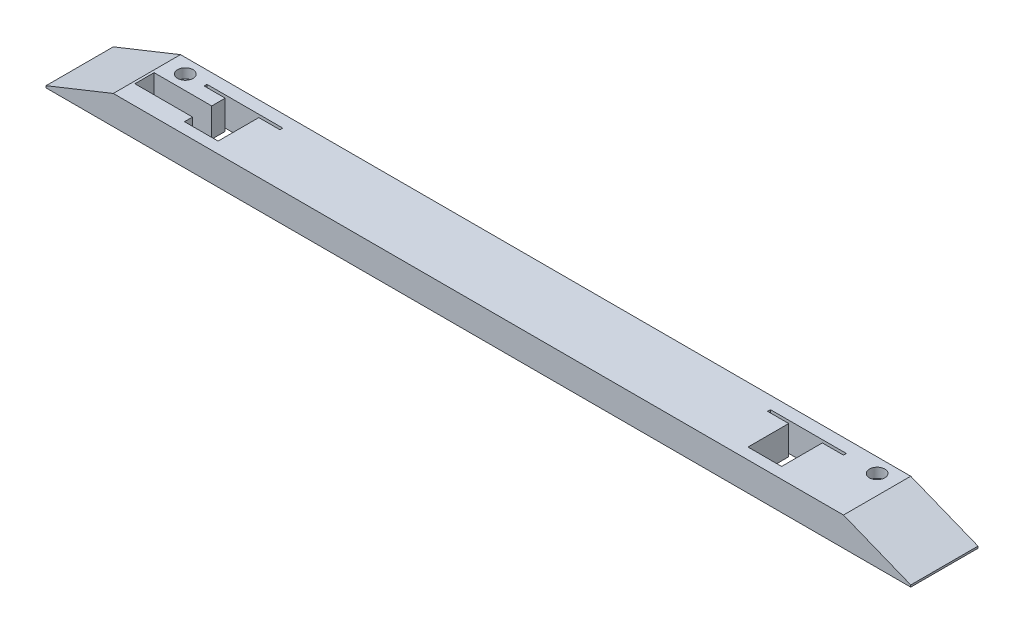
ISO-10303-21;
HEADER;
FILE_DESCRIPTION(('STEP AP214'),'2;1');
FILE_NAME('part.step','',(''),(''),'','','');
FILE_SCHEMA(('AUTOMOTIVE_DESIGN { 1 0 10303 214 1 1 1 1 }'));
ENDSEC;
DATA;
#1=APPLICATION_CONTEXT('core data for automotive mechanical design processes');
#2=APPLICATION_PROTOCOL_DEFINITION('international standard','automotive_design',2000,#1);
#3=PRODUCT_CONTEXT('',#1,'mechanical');
#4=PRODUCT('Part','Part','',(#3));
#5=PRODUCT_RELATED_PRODUCT_CATEGORY('part','',(#4));
#6=PRODUCT_DEFINITION_FORMATION('','',#4);
#7=PRODUCT_DEFINITION_CONTEXT('part definition',#1,'design');
#8=PRODUCT_DEFINITION('design','',#6,#7);
#9=PRODUCT_DEFINITION_SHAPE('','',#8);
#10=(LENGTH_UNIT() NAMED_UNIT(*) SI_UNIT(.MILLI.,.METRE.));
#11=(NAMED_UNIT(*) PLANE_ANGLE_UNIT() SI_UNIT($,.RADIAN.));
#12=(NAMED_UNIT(*) SI_UNIT($,.STERADIAN.) SOLID_ANGLE_UNIT());
#13=UNCERTAINTY_MEASURE_WITH_UNIT(LENGTH_MEASURE(1.E-05),#10,'distance_accuracy_value','');
#14=(GEOMETRIC_REPRESENTATION_CONTEXT(3) GLOBAL_UNCERTAINTY_ASSIGNED_CONTEXT((#13)) GLOBAL_UNIT_ASSIGNED_CONTEXT((#10,
#11,#12)) REPRESENTATION_CONTEXT('',''));
#15=CARTESIAN_POINT('',(0.,0.,0.));
#16=DIRECTION('',(0.,0.,1.));
#17=DIRECTION('',(1.,0.,0.));
#18=AXIS2_PLACEMENT_3D('',#15,#16,#17);
#19=CARTESIAN_POINT('',(0.,1.,0.));
#20=DIRECTION('',(-1.,0.,0.));
#21=DIRECTION('',(0.,0.,1.));
#22=AXIS2_PLACEMENT_3D('',#19,#20,#21);
#23=PLANE('',#22);
#24=DIRECTION('',(0.,-1.,0.));
#25=VECTOR('',#24,1.);
#26=CARTESIAN_POINT('',(0.,1.,35.));
#27=LINE('',#26,#25);
#28=CARTESIAN_POINT('',(0.,1.,35.));
#29=VERTEX_POINT('',#28);
#30=CARTESIAN_POINT('',(0.,0.,35.));
#31=VERTEX_POINT('',#30);
#32=EDGE_CURVE('E358',#29,#31,#27,.T.);
#33=ORIENTED_EDGE('',*,*,#32,.F.);
#34=DIRECTION('',(0.,0.,1.));
#35=VECTOR('',#34,1.);
#36=CARTESIAN_POINT('',(0.,1.,0.));
#37=LINE('',#36,#35);
#38=CARTESIAN_POINT('',(0.,1.,0.));
#39=VERTEX_POINT('',#38);
#40=EDGE_CURVE('E11',#39,#29,#37,.T.);
#41=ORIENTED_EDGE('',*,*,#40,.F.);
#42=DIRECTION('',(0.,-1.,0.));
#43=VECTOR('',#42,1.);
#44=CARTESIAN_POINT('',(0.,1.,0.));
#45=LINE('',#44,#43);
#46=CARTESIAN_POINT('',(0.,0.,0.));
#47=VERTEX_POINT('',#46);
#48=EDGE_CURVE('E373',#39,#47,#45,.T.);
#49=ORIENTED_EDGE('',*,*,#48,.T.);
#50=DIRECTION('',(0.,0.,1.));
#51=VECTOR('',#50,1.);
#52=CARTESIAN_POINT('',(0.,0.,0.));
#53=LINE('',#52,#51);
#54=EDGE_CURVE('E35',#47,#31,#53,.T.);
#55=ORIENTED_EDGE('',*,*,#54,.T.);
#56=EDGE_LOOP('',(#33,#41,#49,#55));
#57=FACE_BOUND('',#56,.T.);
#58=ADVANCED_FACE('F32',(#57),#23,.T.);
#59=CARTESIAN_POINT('',(35.,15.,0.));
#60=DIRECTION('',(-0.371390676354104,0.928476690885259,0.));
#61=DIRECTION('',(-0.92847669088526,-0.371390676354104,0.));
#62=AXIS2_PLACEMENT_3D('',#59,#60,#61);
#63=PLANE('',#62);
#64=DIRECTION('',(-0.928476690885259,-0.371390676354104,0.));
#65=VECTOR('',#64,1.);
#66=CARTESIAN_POINT('',(35.,15.,35.));
#67=LINE('',#66,#65);
#68=CARTESIAN_POINT('',(35.,15.,35.));
#69=VERTEX_POINT('',#68);
#70=EDGE_CURVE('E377',#69,#29,#67,.T.);
#71=ORIENTED_EDGE('',*,*,#70,.F.);
#72=DIRECTION('',(0.,0.,1.));
#73=VECTOR('',#72,1.);
#74=CARTESIAN_POINT('',(35.,15.,0.));
#75=LINE('',#74,#73);
#76=CARTESIAN_POINT('',(35.,15.,0.));
#77=VERTEX_POINT('',#76);
#78=EDGE_CURVE('E40',#77,#69,#75,.T.);
#79=ORIENTED_EDGE('',*,*,#78,.F.);
#80=DIRECTION('',(-0.928476690885259,-0.371390676354104,0.));
#81=VECTOR('',#80,1.);
#82=CARTESIAN_POINT('',(35.,15.,0.));
#83=LINE('',#82,#81);
#84=EDGE_CURVE('E389',#77,#39,#83,.T.);
#85=ORIENTED_EDGE('',*,*,#84,.T.);
#86=ORIENTED_EDGE('',*,*,#40,.T.);
#87=EDGE_LOOP('',(#71,#79,#85,#86));
#88=FACE_BOUND('',#87,.T.);
#89=ADVANCED_FACE('F426',(#88),#63,.T.);
#90=CARTESIAN_POINT('',(415.,15.,0.));
#91=DIRECTION('',(0.,1.,0.));
#92=DIRECTION('',(-1.,0.,0.));
#93=AXIS2_PLACEMENT_3D('',#90,#91,#92);
#94=PLANE('',#93);
#95=CARTESIAN_POINT('',(45.,15.,7.5));
#96=DIRECTION('',(0.,1.,0.));
#97=DIRECTION('',(0.,0.,1.));
#98=AXIS2_PLACEMENT_3D('',#95,#96,#97);
#99=CIRCLE('',#98,3.99999999999999);
#100=CARTESIAN_POINT('',(45.,15.,11.5));
#101=VERTEX_POINT('',#100);
#102=EDGE_CURVE('E763',#101,#101,#99,.T.);
#103=ORIENTED_EDGE('',*,*,#102,.F.);
#104=EDGE_LOOP('',(#103));
#105=FACE_BOUND('',#104,.T.);
#106=CARTESIAN_POINT('',(405.,15.,7.5));
#107=DIRECTION('',(0.,1.,0.));
#108=DIRECTION('',(0.,0.,1.));
#109=AXIS2_PLACEMENT_3D('',#106,#107,#108);
#110=CIRCLE('',#109,4.);
#111=CARTESIAN_POINT('',(405.,15.,11.5));
#112=VERTEX_POINT('',#111);
#113=EDGE_CURVE('E773',#112,#112,#110,.T.);
#114=ORIENTED_EDGE('',*,*,#113,.F.);
#115=EDGE_LOOP('',(#114));
#116=FACE_BOUND('',#115,.T.);
#117=DIRECTION('',(1.,0.,0.));
#118=VECTOR('',#117,1.);
#119=CARTESIAN_POINT('',(36.2499999999999,15.,15.0000000000001));
#120=LINE('',#119,#118);
#121=CARTESIAN_POINT('',(36.2499999999999,15.,15.0000000000001));
#122=VERTEX_POINT('',#121);
#123=CARTESIAN_POINT('',(66.2499999999999,15.,15.0000000000001));
#124=VERTEX_POINT('',#123);
#125=EDGE_CURVE('E207',#122,#124,#120,.T.);
#126=ORIENTED_EDGE('',*,*,#125,.T.);
#127=DIRECTION('',(0.,0.,-1.));
#128=VECTOR('',#127,1.);
#129=CARTESIAN_POINT('',(66.2499999999999,15.,15.0000000000001));
#130=LINE('',#129,#128);
#131=CARTESIAN_POINT('',(66.2499999999999,15.,8.00000000000015));
#132=VERTEX_POINT('',#131);
#133=EDGE_CURVE('E216',#124,#132,#130,.T.);
#134=ORIENTED_EDGE('',*,*,#133,.T.);
#135=DIRECTION('',(-1.,0.,0.));
#136=VECTOR('',#135,1.);
#137=CARTESIAN_POINT('',(66.2499999999999,15.,8.00000000000015));
#138=LINE('',#137,#136);
#139=CARTESIAN_POINT('',(55.25,15.,8.00000000000015));
#140=VERTEX_POINT('',#139);
#141=EDGE_CURVE('E48',#132,#140,#138,.T.);
#142=ORIENTED_EDGE('',*,*,#141,.T.);
#143=DIRECTION('',(0.,0.,-1.));
#144=VECTOR('',#143,1.);
#145=CARTESIAN_POINT('',(55.25,15.,8.00000000000015));
#146=LINE('',#145,#144);
#147=CARTESIAN_POINT('',(55.25,15.,6.50000000000015));
#148=VERTEX_POINT('',#147);
#149=EDGE_CURVE('E234',#140,#148,#146,.T.);
#150=ORIENTED_EDGE('',*,*,#149,.T.);
#151=DIRECTION('',(1.,0.,0.));
#152=VECTOR('',#151,1.);
#153=CARTESIAN_POINT('',(55.25,15.,6.50000000000015));
#154=LINE('',#153,#152);
#155=CARTESIAN_POINT('',(94.75,15.,6.50000000000015));
#156=VERTEX_POINT('',#155);
#157=EDGE_CURVE('E237',#148,#156,#154,.T.);
#158=ORIENTED_EDGE('',*,*,#157,.T.);
#159=DIRECTION('',(0.,0.,1.));
#160=VECTOR('',#159,1.);
#161=CARTESIAN_POINT('',(94.75,15.,6.50000000000015));
#162=LINE('',#161,#160);
#163=CARTESIAN_POINT('',(94.75,15.,8.00000000000015));
#164=VERTEX_POINT('',#163);
#165=EDGE_CURVE('E240',#156,#164,#162,.T.);
#166=ORIENTED_EDGE('',*,*,#165,.T.);
#167=DIRECTION('',(-1.,0.,0.));
#168=VECTOR('',#167,1.);
#169=CARTESIAN_POINT('',(94.75,15.,8.00000000000015));
#170=LINE('',#169,#168);
#171=CARTESIAN_POINT('',(83.7499999999999,15.,8.00000000000015));
#172=VERTEX_POINT('',#171);
#173=EDGE_CURVE('E243',#164,#172,#170,.T.);
#174=ORIENTED_EDGE('',*,*,#173,.T.);
#175=DIRECTION('',(0.,0.,1.));
#176=VECTOR('',#175,1.);
#177=CARTESIAN_POINT('',(83.7499999999999,15.,8.00000000000015));
#178=LINE('',#177,#176);
#179=CARTESIAN_POINT('',(83.7499999999999,15.,29.2000000000001));
#180=VERTEX_POINT('',#179);
#181=EDGE_CURVE('E246',#172,#180,#178,.T.);
#182=ORIENTED_EDGE('',*,*,#181,.T.);
#183=DIRECTION('',(-1.,0.,0.));
#184=VECTOR('',#183,1.);
#185=CARTESIAN_POINT('',(83.7499999999999,15.,29.2000000000001));
#186=LINE('',#185,#184);
#187=CARTESIAN_POINT('',(66.2499999999999,15.,29.2000000000001));
#188=VERTEX_POINT('',#187);
#189=EDGE_CURVE('E249',#180,#188,#186,.T.);
#190=ORIENTED_EDGE('',*,*,#189,.T.);
#191=DIRECTION('',(0.,0.,-1.));
#192=VECTOR('',#191,1.);
#193=CARTESIAN_POINT('',(66.2499999999999,15.,29.2000000000001));
#194=LINE('',#193,#192);
#195=CARTESIAN_POINT('',(66.2499999999999,15.,25.0000000000001));
#196=VERTEX_POINT('',#195);
#197=EDGE_CURVE('E252',#188,#196,#194,.T.);
#198=ORIENTED_EDGE('',*,*,#197,.T.);
#199=DIRECTION('',(-1.,0.,0.));
#200=VECTOR('',#199,1.);
#201=CARTESIAN_POINT('',(66.2499999999999,15.,25.0000000000001));
#202=LINE('',#201,#200);
#203=CARTESIAN_POINT('',(36.2499999999999,15.,25.0000000000001));
#204=VERTEX_POINT('',#203);
#205=EDGE_CURVE('E255',#196,#204,#202,.T.);
#206=ORIENTED_EDGE('',*,*,#205,.T.);
#207=DIRECTION('',(0.,0.,-1.));
#208=VECTOR('',#207,1.);
#209=CARTESIAN_POINT('',(36.2499999999999,15.,25.0000000000001));
#210=LINE('',#209,#208);
#211=EDGE_CURVE('E213',#204,#122,#210,.T.);
#212=ORIENTED_EDGE('',*,*,#211,.T.);
#213=EDGE_LOOP('',(#126,#134,#142,#150,#158,#166,#174,#182,#190,#198,#206,#212));
#214=FACE_BOUND('',#213,.T.);
#215=DIRECTION('',(1.,0.,0.));
#216=VECTOR('',#215,1.);
#217=CARTESIAN_POINT('',(348.5,15.,8.00000000000015));
#218=LINE('',#217,#216);
#219=CARTESIAN_POINT('',(348.5,15.,8.00000000000015));
#220=VERTEX_POINT('',#219);
#221=CARTESIAN_POINT('',(359.5,15.,8.00000000000015));
#222=VERTEX_POINT('',#221);
#223=EDGE_CURVE('E289',#220,#222,#218,.T.);
#224=ORIENTED_EDGE('',*,*,#223,.F.);
#225=DIRECTION('',(0.,0.,1.));
#226=VECTOR('',#225,1.);
#227=CARTESIAN_POINT('',(348.5,15.,6.50000000000015));
#228=LINE('',#227,#226);
#229=CARTESIAN_POINT('',(348.5,15.,6.50000000000015));
#230=VERTEX_POINT('',#229);
#231=EDGE_CURVE('E313',#230,#220,#228,.T.);
#232=ORIENTED_EDGE('',*,*,#231,.F.);
#233=DIRECTION('',(-1.,0.,0.));
#234=VECTOR('',#233,1.);
#235=CARTESIAN_POINT('',(388.,15.,6.50000000000015));
#236=LINE('',#235,#234);
#237=CARTESIAN_POINT('',(388.,15.,6.50000000000015));
#238=VERTEX_POINT('',#237);
#239=EDGE_CURVE('E351',#238,#230,#236,.T.);
#240=ORIENTED_EDGE('',*,*,#239,.F.);
#241=DIRECTION('',(0.,0.,-1.));
#242=VECTOR('',#241,1.);
#243=CARTESIAN_POINT('',(388.,15.,8.00000000000015));
#244=LINE('',#243,#242);
#245=CARTESIAN_POINT('',(388.,15.,8.00000000000015));
#246=VERTEX_POINT('',#245);
#247=EDGE_CURVE('E348',#246,#238,#244,.T.);
#248=ORIENTED_EDGE('',*,*,#247,.F.);
#249=DIRECTION('',(1.,0.,0.));
#250=VECTOR('',#249,1.);
#251=CARTESIAN_POINT('',(377.,15.,8.00000000000015));
#252=LINE('',#251,#250);
#253=CARTESIAN_POINT('',(377.,15.,8.00000000000015));
#254=VERTEX_POINT('',#253);
#255=EDGE_CURVE('E345',#254,#246,#252,.T.);
#256=ORIENTED_EDGE('',*,*,#255,.F.);
#257=DIRECTION('',(0.,0.,-1.));
#258=VECTOR('',#257,1.);
#259=CARTESIAN_POINT('',(377.,15.,29.2000000000001));
#260=LINE('',#259,#258);
#261=CARTESIAN_POINT('',(377.,15.,29.2000000000001));
#262=VERTEX_POINT('',#261);
#263=EDGE_CURVE('E342',#262,#254,#260,.T.);
#264=ORIENTED_EDGE('',*,*,#263,.F.);
#265=DIRECTION('',(1.,0.,0.));
#266=VECTOR('',#265,1.);
#267=CARTESIAN_POINT('',(359.5,15.,29.2000000000001));
#268=LINE('',#267,#266);
#269=CARTESIAN_POINT('',(359.5,15.,29.2000000000001));
#270=VERTEX_POINT('',#269);
#271=EDGE_CURVE('E339',#270,#262,#268,.T.);
#272=ORIENTED_EDGE('',*,*,#271,.F.);
#273=DIRECTION('',(0.,0.,1.));
#274=VECTOR('',#273,1.);
#275=CARTESIAN_POINT('',(359.5,15.,8.00000000000015));
#276=LINE('',#275,#274);
#277=EDGE_CURVE('E336',#222,#270,#276,.T.);
#278=ORIENTED_EDGE('',*,*,#277,.F.);
#279=EDGE_LOOP('',(#224,#232,#240,#248,#256,#264,#272,#278));
#280=FACE_BOUND('',#279,.T.);
#281=DIRECTION('',(-1.,0.,0.));
#282=VECTOR('',#281,1.);
#283=CARTESIAN_POINT('',(415.,15.,35.));
#284=LINE('',#283,#282);
#285=CARTESIAN_POINT('',(415.,15.,35.));
#286=VERTEX_POINT('',#285);
#287=EDGE_CURVE('E403',#286,#69,#284,.T.);
#288=ORIENTED_EDGE('',*,*,#287,.F.);
#289=DIRECTION('',(0.,0.,1.));
#290=VECTOR('',#289,1.);
#291=CARTESIAN_POINT('',(415.,15.,0.));
#292=LINE('',#291,#290);
#293=CARTESIAN_POINT('',(415.,15.,0.));
#294=VERTEX_POINT('',#293);
#295=EDGE_CURVE('E409',#294,#286,#292,.T.);
#296=ORIENTED_EDGE('',*,*,#295,.F.);
#297=DIRECTION('',(-1.,0.,0.));
#298=VECTOR('',#297,1.);
#299=CARTESIAN_POINT('',(415.,15.,0.));
#300=LINE('',#299,#298);
#301=EDGE_CURVE('E386',#294,#77,#300,.T.);
#302=ORIENTED_EDGE('',*,*,#301,.T.);
#303=ORIENTED_EDGE('',*,*,#78,.T.);
#304=EDGE_LOOP('',(#288,#296,#302,#303));
#305=FACE_BOUND('',#304,.T.);
#306=ADVANCED_FACE('F220',(#105,#116,#214,#280,#305),#94,.T.);
#307=CARTESIAN_POINT('',(450.,1.,0.));
#308=DIRECTION('',(0.371390676354103,0.92847669088526,0.));
#309=DIRECTION('',(-0.92847669088526,0.371390676354103,0.));
#310=AXIS2_PLACEMENT_3D('',#307,#308,#309);
#311=PLANE('',#310);
#312=DIRECTION('',(-0.92847669088526,0.371390676354103,0.));
#313=VECTOR('',#312,1.);
#314=CARTESIAN_POINT('',(450.,1.,35.));
#315=LINE('',#314,#313);
#316=CARTESIAN_POINT('',(450.,1.,35.));
#317=VERTEX_POINT('',#316);
#318=EDGE_CURVE('E400',#317,#286,#315,.T.);
#319=ORIENTED_EDGE('',*,*,#318,.F.);
#320=DIRECTION('',(0.,0.,1.));
#321=VECTOR('',#320,1.);
#322=CARTESIAN_POINT('',(450.,1.,0.));
#323=LINE('',#322,#321);
#324=CARTESIAN_POINT('',(450.,1.,0.));
#325=VERTEX_POINT('',#324);
#326=EDGE_CURVE('E411',#325,#317,#323,.T.);
#327=ORIENTED_EDGE('',*,*,#326,.F.);
#328=DIRECTION('',(-0.92847669088526,0.371390676354103,0.));
#329=VECTOR('',#328,1.);
#330=CARTESIAN_POINT('',(450.,1.,0.));
#331=LINE('',#330,#329);
#332=EDGE_CURVE('E383',#325,#294,#331,.T.);
#333=ORIENTED_EDGE('',*,*,#332,.T.);
#334=ORIENTED_EDGE('',*,*,#295,.T.);
#335=EDGE_LOOP('',(#319,#327,#333,#334));
#336=FACE_BOUND('',#335,.T.);
#337=ADVANCED_FACE('F437',(#336),#311,.T.);
#338=CARTESIAN_POINT('',(450.,0.,0.));
#339=DIRECTION('',(1.,0.,0.));
#340=DIRECTION('',(0.,1.,0.));
#341=AXIS2_PLACEMENT_3D('',#338,#339,#340);
#342=PLANE('',#341);
#343=DIRECTION('',(0.,1.,0.));
#344=VECTOR('',#343,1.);
#345=CARTESIAN_POINT('',(450.,0.,35.));
#346=LINE('',#345,#344);
#347=CARTESIAN_POINT('',(450.,0.,35.));
#348=VERTEX_POINT('',#347);
#349=EDGE_CURVE('E397',#348,#317,#346,.T.);
#350=ORIENTED_EDGE('',*,*,#349,.F.);
#351=DIRECTION('',(0.,0.,1.));
#352=VECTOR('',#351,1.);
#353=CARTESIAN_POINT('',(450.,0.,0.));
#354=LINE('',#353,#352);
#355=CARTESIAN_POINT('',(450.,0.,0.));
#356=VERTEX_POINT('',#355);
#357=EDGE_CURVE('E412',#356,#348,#354,.T.);
#358=ORIENTED_EDGE('',*,*,#357,.F.);
#359=DIRECTION('',(0.,1.,0.));
#360=VECTOR('',#359,1.);
#361=CARTESIAN_POINT('',(450.,0.,0.));
#362=LINE('',#361,#360);
#363=EDGE_CURVE('E380',#356,#325,#362,.T.);
#364=ORIENTED_EDGE('',*,*,#363,.T.);
#365=ORIENTED_EDGE('',*,*,#326,.T.);
#366=EDGE_LOOP('',(#350,#358,#364,#365));
#367=FACE_BOUND('',#366,.T.);
#368=ADVANCED_FACE('F434',(#367),#342,.T.);
#369=CARTESIAN_POINT('',(0.,0.,0.));
#370=DIRECTION('',(0.,-1.,0.));
#371=DIRECTION('',(0.,0.,-1.));
#372=AXIS2_PLACEMENT_3D('',#369,#370,#371);
#373=PLANE('',#372);
#374=CARTESIAN_POINT('',(45.,0.,7.5));
#375=DIRECTION('',(0.,1.,0.));
#376=DIRECTION('',(0.,0.,1.));
#377=AXIS2_PLACEMENT_3D('',#374,#375,#376);
#378=CIRCLE('',#377,2.50000000000001);
#379=CARTESIAN_POINT('',(45.,0.,10.));
#380=VERTEX_POINT('',#379);
#381=EDGE_CURVE('E770',#380,#380,#378,.T.);
#382=ORIENTED_EDGE('',*,*,#381,.T.);
#383=EDGE_LOOP('',(#382));
#384=FACE_BOUND('',#383,.T.);
#385=CARTESIAN_POINT('',(405.,0.,7.5));
#386=DIRECTION('',(0.,1.,0.));
#387=DIRECTION('',(0.,0.,1.));
#388=AXIS2_PLACEMENT_3D('',#385,#386,#387);
#389=CIRCLE('',#388,2.5);
#390=CARTESIAN_POINT('',(405.,0.,10.));
#391=VERTEX_POINT('',#390);
#392=EDGE_CURVE('E230',#391,#391,#389,.T.);
#393=ORIENTED_EDGE('',*,*,#392,.T.);
#394=EDGE_LOOP('',(#393));
#395=FACE_BOUND('',#394,.T.);
#396=DIRECTION('',(1.,0.,0.));
#397=VECTOR('',#396,1.);
#398=CARTESIAN_POINT('',(36.2499999999999,0.,15.0000000000001));
#399=LINE('',#398,#397);
#400=CARTESIAN_POINT('',(36.2499999999999,0.,15.0000000000001));
#401=VERTEX_POINT('',#400);
#402=CARTESIAN_POINT('',(66.2499999999999,0.,15.0000000000001));
#403=VERTEX_POINT('',#402);
#404=EDGE_CURVE('E56',#401,#403,#399,.T.);
#405=ORIENTED_EDGE('',*,*,#404,.F.);
#406=DIRECTION('',(0.,0.,-1.));
#407=VECTOR('',#406,1.);
#408=CARTESIAN_POINT('',(36.2499999999999,0.,25.0000000000001));
#409=LINE('',#408,#407);
#410=CARTESIAN_POINT('',(36.2499999999999,0.,25.0000000000001));
#411=VERTEX_POINT('',#410);
#412=EDGE_CURVE('E224',#411,#401,#409,.T.);
#413=ORIENTED_EDGE('',*,*,#412,.F.);
#414=DIRECTION('',(-1.,0.,0.));
#415=VECTOR('',#414,1.);
#416=CARTESIAN_POINT('',(66.2499999999999,0.,25.0000000000001));
#417=LINE('',#416,#415);
#418=CARTESIAN_POINT('',(66.2499999999999,0.,25.0000000000001));
#419=VERTEX_POINT('',#418);
#420=EDGE_CURVE('E227',#419,#411,#417,.T.);
#421=ORIENTED_EDGE('',*,*,#420,.F.);
#422=DIRECTION('',(0.,0.,-1.));
#423=VECTOR('',#422,1.);
#424=CARTESIAN_POINT('',(66.2499999999999,0.,29.2000000000001));
#425=LINE('',#424,#423);
#426=CARTESIAN_POINT('',(66.2499999999999,0.,29.2000000000001));
#427=VERTEX_POINT('',#426);
#428=EDGE_CURVE('E282',#427,#419,#425,.T.);
#429=ORIENTED_EDGE('',*,*,#428,.F.);
#430=DIRECTION('',(-1.,0.,0.));
#431=VECTOR('',#430,1.);
#432=CARTESIAN_POINT('',(83.7499999999999,0.,29.2000000000001));
#433=LINE('',#432,#431);
#434=CARTESIAN_POINT('',(83.7499999999999,0.,29.2000000000001));
#435=VERTEX_POINT('',#434);
#436=EDGE_CURVE('E279',#435,#427,#433,.T.);
#437=ORIENTED_EDGE('',*,*,#436,.F.);
#438=DIRECTION('',(0.,0.,1.));
#439=VECTOR('',#438,1.);
#440=CARTESIAN_POINT('',(83.7499999999999,0.,8.00000000000015));
#441=LINE('',#440,#439);
#442=CARTESIAN_POINT('',(83.7499999999999,0.,8.00000000000015));
#443=VERTEX_POINT('',#442);
#444=EDGE_CURVE('E276',#443,#435,#441,.T.);
#445=ORIENTED_EDGE('',*,*,#444,.F.);
#446=DIRECTION('',(-1.,0.,0.));
#447=VECTOR('',#446,1.);
#448=CARTESIAN_POINT('',(94.75,0.,8.00000000000015));
#449=LINE('',#448,#447);
#450=CARTESIAN_POINT('',(94.75,0.,8.00000000000015));
#451=VERTEX_POINT('',#450);
#452=EDGE_CURVE('E273',#451,#443,#449,.T.);
#453=ORIENTED_EDGE('',*,*,#452,.F.);
#454=DIRECTION('',(0.,0.,1.));
#455=VECTOR('',#454,1.);
#456=CARTESIAN_POINT('',(94.75,0.,6.50000000000015));
#457=LINE('',#456,#455);
#458=CARTESIAN_POINT('',(94.75,0.,6.50000000000015));
#459=VERTEX_POINT('',#458);
#460=EDGE_CURVE('E270',#459,#451,#457,.T.);
#461=ORIENTED_EDGE('',*,*,#460,.F.);
#462=DIRECTION('',(1.,0.,0.));
#463=VECTOR('',#462,1.);
#464=CARTESIAN_POINT('',(55.25,0.,6.50000000000015));
#465=LINE('',#464,#463);
#466=CARTESIAN_POINT('',(55.25,0.,6.50000000000015));
#467=VERTEX_POINT('',#466);
#468=EDGE_CURVE('E267',#467,#459,#465,.T.);
#469=ORIENTED_EDGE('',*,*,#468,.F.);
#470=DIRECTION('',(0.,0.,-1.));
#471=VECTOR('',#470,1.);
#472=CARTESIAN_POINT('',(55.25,0.,8.00000000000015));
#473=LINE('',#472,#471);
#474=CARTESIAN_POINT('',(55.25,0.,8.00000000000015));
#475=VERTEX_POINT('',#474);
#476=EDGE_CURVE('E264',#475,#467,#473,.T.);
#477=ORIENTED_EDGE('',*,*,#476,.F.);
#478=DIRECTION('',(-1.,0.,0.));
#479=VECTOR('',#478,1.);
#480=CARTESIAN_POINT('',(66.2499999999999,0.,8.00000000000015));
#481=LINE('',#480,#479);
#482=CARTESIAN_POINT('',(66.2499999999999,0.,8.00000000000015));
#483=VERTEX_POINT('',#482);
#484=EDGE_CURVE('E261',#483,#475,#481,.T.);
#485=ORIENTED_EDGE('',*,*,#484,.F.);
#486=DIRECTION('',(0.,0.,-1.));
#487=VECTOR('',#486,1.);
#488=CARTESIAN_POINT('',(66.2499999999999,0.,15.0000000000001));
#489=LINE('',#488,#487);
#490=EDGE_CURVE('E259',#403,#483,#489,.T.);
#491=ORIENTED_EDGE('',*,*,#490,.F.);
#492=EDGE_LOOP('',(#405,#413,#421,#429,#437,#445,#453,#461,#469,#477,#485,#491));
#493=FACE_BOUND('',#492,.T.);
#494=DIRECTION('',(1.,0.,0.));
#495=VECTOR('',#494,1.);
#496=CARTESIAN_POINT('',(348.5,0.,8.00000000000015));
#497=LINE('',#496,#495);
#498=CARTESIAN_POINT('',(348.5,0.,8.00000000000015));
#499=VERTEX_POINT('',#498);
#500=CARTESIAN_POINT('',(359.5,0.,8.00000000000015));
#501=VERTEX_POINT('',#500);
#502=EDGE_CURVE('E309',#499,#501,#497,.T.);
#503=ORIENTED_EDGE('',*,*,#502,.T.);
#504=DIRECTION('',(0.,0.,1.));
#505=VECTOR('',#504,1.);
#506=CARTESIAN_POINT('',(359.5,0.,8.00000000000015));
#507=LINE('',#506,#505);
#508=CARTESIAN_POINT('',(359.5,0.,29.2000000000001));
#509=VERTEX_POINT('',#508);
#510=EDGE_CURVE('E312',#501,#509,#507,.T.);
#511=ORIENTED_EDGE('',*,*,#510,.T.);
#512=DIRECTION('',(1.,0.,0.));
#513=VECTOR('',#512,1.);
#514=CARTESIAN_POINT('',(359.5,0.,29.2000000000001));
#515=LINE('',#514,#513);
#516=CARTESIAN_POINT('',(377.,0.,29.2000000000001));
#517=VERTEX_POINT('',#516);
#518=EDGE_CURVE('E316',#509,#517,#515,.T.);
#519=ORIENTED_EDGE('',*,*,#518,.T.);
#520=DIRECTION('',(0.,0.,-1.));
#521=VECTOR('',#520,1.);
#522=CARTESIAN_POINT('',(377.,0.,29.2000000000001));
#523=LINE('',#522,#521);
#524=CARTESIAN_POINT('',(377.,0.,8.00000000000015));
#525=VERTEX_POINT('',#524);
#526=EDGE_CURVE('E319',#517,#525,#523,.T.);
#527=ORIENTED_EDGE('',*,*,#526,.T.);
#528=DIRECTION('',(1.,0.,0.));
#529=VECTOR('',#528,1.);
#530=CARTESIAN_POINT('',(377.,0.,8.00000000000015));
#531=LINE('',#530,#529);
#532=CARTESIAN_POINT('',(388.,0.,8.00000000000015));
#533=VERTEX_POINT('',#532);
#534=EDGE_CURVE('E322',#525,#533,#531,.T.);
#535=ORIENTED_EDGE('',*,*,#534,.T.);
#536=DIRECTION('',(0.,0.,-1.));
#537=VECTOR('',#536,1.);
#538=CARTESIAN_POINT('',(388.,0.,8.00000000000015));
#539=LINE('',#538,#537);
#540=CARTESIAN_POINT('',(388.,0.,6.50000000000015));
#541=VERTEX_POINT('',#540);
#542=EDGE_CURVE('E325',#533,#541,#539,.T.);
#543=ORIENTED_EDGE('',*,*,#542,.T.);
#544=DIRECTION('',(-1.,0.,0.));
#545=VECTOR('',#544,1.);
#546=CARTESIAN_POINT('',(388.,0.,6.50000000000015));
#547=LINE('',#546,#545);
#548=CARTESIAN_POINT('',(348.5,0.,6.50000000000015));
#549=VERTEX_POINT('',#548);
#550=EDGE_CURVE('E328',#541,#549,#547,.T.);
#551=ORIENTED_EDGE('',*,*,#550,.T.);
#552=DIRECTION('',(0.,0.,1.));
#553=VECTOR('',#552,1.);
#554=CARTESIAN_POINT('',(348.5,0.,6.50000000000015));
#555=LINE('',#554,#553);
#556=EDGE_CURVE('E331',#549,#499,#555,.T.);
#557=ORIENTED_EDGE('',*,*,#556,.T.);
#558=EDGE_LOOP('',(#503,#511,#519,#527,#535,#543,#551,#557));
#559=FACE_BOUND('',#558,.T.);
#560=DIRECTION('',(1.,0.,0.));
#561=VECTOR('',#560,1.);
#562=CARTESIAN_POINT('',(0.,0.,35.));
#563=LINE('',#562,#561);
#564=EDGE_CURVE('E394',#31,#348,#563,.T.);
#565=ORIENTED_EDGE('',*,*,#564,.F.);
#566=ORIENTED_EDGE('',*,*,#54,.F.);
#567=DIRECTION('',(1.,0.,0.));
#568=VECTOR('',#567,1.);
#569=CARTESIAN_POINT('',(0.,0.,0.));
#570=LINE('',#569,#568);
#571=EDGE_CURVE('E376',#47,#356,#570,.T.);
#572=ORIENTED_EDGE('',*,*,#571,.T.);
#573=ORIENTED_EDGE('',*,*,#357,.T.);
#574=EDGE_LOOP('',(#565,#566,#572,#573));
#575=FACE_BOUND('',#574,.T.);
#576=ADVANCED_FACE('F420',(#384,#395,#493,#559,#575),#373,.T.);
#577=CARTESIAN_POINT('',(0.,0.,0.));
#578=DIRECTION('',(0.,0.,1.));
#579=DIRECTION('',(1.,0.,0.));
#580=AXIS2_PLACEMENT_3D('',#577,#578,#579);
#581=PLANE('',#580);
#582=ORIENTED_EDGE('',*,*,#48,.F.);
#583=ORIENTED_EDGE('',*,*,#84,.F.);
#584=ORIENTED_EDGE('',*,*,#301,.F.);
#585=ORIENTED_EDGE('',*,*,#332,.F.);
#586=ORIENTED_EDGE('',*,*,#363,.F.);
#587=ORIENTED_EDGE('',*,*,#571,.F.);
#588=EDGE_LOOP('',(#582,#583,#584,#585,#586,#587));
#589=FACE_BOUND('',#588,.T.);
#590=ADVANCED_FACE('F429',(#589),#581,.F.);
#591=CARTESIAN_POINT('',(0.,0.,35.));
#592=DIRECTION('',(0.,0.,1.));
#593=DIRECTION('',(1.,0.,0.));
#594=AXIS2_PLACEMENT_3D('',#591,#592,#593);
#595=PLANE('',#594);
#596=ORIENTED_EDGE('',*,*,#32,.T.);
#597=ORIENTED_EDGE('',*,*,#564,.T.);
#598=ORIENTED_EDGE('',*,*,#349,.T.);
#599=ORIENTED_EDGE('',*,*,#318,.T.);
#600=ORIENTED_EDGE('',*,*,#287,.T.);
#601=ORIENTED_EDGE('',*,*,#70,.T.);
#602=EDGE_LOOP('',(#596,#597,#598,#599,#600,#601));
#603=FACE_BOUND('',#602,.T.);
#604=ADVANCED_FACE('F422',(#603),#595,.T.);
#605=CARTESIAN_POINT('',(348.5,0.,8.00000000000015));
#606=DIRECTION('',(0.,0.,1.));
#607=DIRECTION('',(1.,0.,0.));
#608=AXIS2_PLACEMENT_3D('',#605,#606,#607);
#609=PLANE('',#608);
#610=ORIENTED_EDGE('',*,*,#223,.T.);
#611=DIRECTION('',(0.,1.,0.));
#612=VECTOR('',#611,1.);
#613=CARTESIAN_POINT('',(359.5,0.,8.00000000000015));
#614=LINE('',#613,#612);
#615=EDGE_CURVE('E334',#501,#222,#614,.T.);
#616=ORIENTED_EDGE('',*,*,#615,.F.);
#617=ORIENTED_EDGE('',*,*,#502,.F.);
#618=DIRECTION('',(0.,1.,0.));
#619=VECTOR('',#618,1.);
#620=CARTESIAN_POINT('',(348.5,0.,8.00000000000015));
#621=LINE('',#620,#619);
#622=EDGE_CURVE('E356',#499,#220,#621,.T.);
#623=ORIENTED_EDGE('',*,*,#622,.T.);
#624=EDGE_LOOP('',(#610,#616,#617,#623));
#625=FACE_BOUND('',#624,.T.);
#626=ADVANCED_FACE('F491',(#625),#609,.F.);
#627=CARTESIAN_POINT('',(348.5,0.,6.50000000000015));
#628=DIRECTION('',(-1.,0.,0.));
#629=DIRECTION('',(0.,-1.,0.));
#630=AXIS2_PLACEMENT_3D('',#627,#628,#629);
#631=PLANE('',#630);
#632=ORIENTED_EDGE('',*,*,#231,.T.);
#633=ORIENTED_EDGE('',*,*,#622,.F.);
#634=ORIENTED_EDGE('',*,*,#556,.F.);
#635=DIRECTION('',(0.,1.,0.));
#636=VECTOR('',#635,1.);
#637=CARTESIAN_POINT('',(348.5,0.,6.50000000000015));
#638=LINE('',#637,#636);
#639=EDGE_CURVE('E359',#549,#230,#638,.T.);
#640=ORIENTED_EDGE('',*,*,#639,.T.);
#641=EDGE_LOOP('',(#632,#633,#634,#640));
#642=FACE_BOUND('',#641,.T.);
#643=ADVANCED_FACE('F500',(#642),#631,.F.);
#644=CARTESIAN_POINT('',(388.,0.,6.50000000000015));
#645=DIRECTION('',(0.,0.,-1.));
#646=DIRECTION('',(-1.,0.,0.));
#647=AXIS2_PLACEMENT_3D('',#644,#645,#646);
#648=PLANE('',#647);
#649=ORIENTED_EDGE('',*,*,#239,.T.);
#650=ORIENTED_EDGE('',*,*,#639,.F.);
#651=ORIENTED_EDGE('',*,*,#550,.F.);
#652=DIRECTION('',(0.,1.,0.));
#653=VECTOR('',#652,1.);
#654=CARTESIAN_POINT('',(388.,0.,6.50000000000015));
#655=LINE('',#654,#653);
#656=EDGE_CURVE('E361',#541,#238,#655,.T.);
#657=ORIENTED_EDGE('',*,*,#656,.T.);
#658=EDGE_LOOP('',(#649,#650,#651,#657));
#659=FACE_BOUND('',#658,.T.);
#660=ADVANCED_FACE('F510',(#659),#648,.F.);
#661=CARTESIAN_POINT('',(388.,0.,8.00000000000015));
#662=DIRECTION('',(1.,0.,0.));
#663=DIRECTION('',(0.,1.,0.));
#664=AXIS2_PLACEMENT_3D('',#661,#662,#663);
#665=PLANE('',#664);
#666=ORIENTED_EDGE('',*,*,#247,.T.);
#667=ORIENTED_EDGE('',*,*,#656,.F.);
#668=ORIENTED_EDGE('',*,*,#542,.F.);
#669=DIRECTION('',(0.,1.,0.));
#670=VECTOR('',#669,1.);
#671=CARTESIAN_POINT('',(388.,0.,8.00000000000015));
#672=LINE('',#671,#670);
#673=EDGE_CURVE('E363',#533,#246,#672,.T.);
#674=ORIENTED_EDGE('',*,*,#673,.T.);
#675=EDGE_LOOP('',(#666,#667,#668,#674));
#676=FACE_BOUND('',#675,.T.);
#677=ADVANCED_FACE('F520',(#676),#665,.F.);
#678=CARTESIAN_POINT('',(377.,0.,8.00000000000015));
#679=DIRECTION('',(0.,0.,1.));
#680=DIRECTION('',(1.,0.,0.));
#681=AXIS2_PLACEMENT_3D('',#678,#679,#680);
#682=PLANE('',#681);
#683=ORIENTED_EDGE('',*,*,#255,.T.);
#684=ORIENTED_EDGE('',*,*,#673,.F.);
#685=ORIENTED_EDGE('',*,*,#534,.F.);
#686=DIRECTION('',(0.,1.,0.));
#687=VECTOR('',#686,1.);
#688=CARTESIAN_POINT('',(377.,0.,8.00000000000015));
#689=LINE('',#688,#687);
#690=EDGE_CURVE('E365',#525,#254,#689,.T.);
#691=ORIENTED_EDGE('',*,*,#690,.T.);
#692=EDGE_LOOP('',(#683,#684,#685,#691));
#693=FACE_BOUND('',#692,.T.);
#694=ADVANCED_FACE('F530',(#693),#682,.F.);
#695=CARTESIAN_POINT('',(377.,0.,29.2000000000001));
#696=DIRECTION('',(1.,0.,0.));
#697=DIRECTION('',(0.,1.,0.));
#698=AXIS2_PLACEMENT_3D('',#695,#696,#697);
#699=PLANE('',#698);
#700=ORIENTED_EDGE('',*,*,#263,.T.);
#701=ORIENTED_EDGE('',*,*,#690,.F.);
#702=ORIENTED_EDGE('',*,*,#526,.F.);
#703=DIRECTION('',(0.,1.,0.));
#704=VECTOR('',#703,1.);
#705=CARTESIAN_POINT('',(377.,0.,29.2000000000001));
#706=LINE('',#705,#704);
#707=EDGE_CURVE('E367',#517,#262,#706,.T.);
#708=ORIENTED_EDGE('',*,*,#707,.T.);
#709=EDGE_LOOP('',(#700,#701,#702,#708));
#710=FACE_BOUND('',#709,.T.);
#711=ADVANCED_FACE('F540',(#710),#699,.F.);
#712=CARTESIAN_POINT('',(359.5,0.,29.2000000000001));
#713=DIRECTION('',(0.,0.,1.));
#714=DIRECTION('',(1.,0.,0.));
#715=AXIS2_PLACEMENT_3D('',#712,#713,#714);
#716=PLANE('',#715);
#717=ORIENTED_EDGE('',*,*,#271,.T.);
#718=ORIENTED_EDGE('',*,*,#707,.F.);
#719=ORIENTED_EDGE('',*,*,#518,.F.);
#720=DIRECTION('',(0.,1.,0.));
#721=VECTOR('',#720,1.);
#722=CARTESIAN_POINT('',(359.5,0.,29.2000000000001));
#723=LINE('',#722,#721);
#724=EDGE_CURVE('E369',#509,#270,#723,.T.);
#725=ORIENTED_EDGE('',*,*,#724,.T.);
#726=EDGE_LOOP('',(#717,#718,#719,#725));
#727=FACE_BOUND('',#726,.T.);
#728=ADVANCED_FACE('F550',(#727),#716,.F.);
#729=CARTESIAN_POINT('',(359.5,0.,8.00000000000015));
#730=DIRECTION('',(-1.,0.,0.));
#731=DIRECTION('',(0.,-1.,0.));
#732=AXIS2_PLACEMENT_3D('',#729,#730,#731);
#733=PLANE('',#732);
#734=ORIENTED_EDGE('',*,*,#277,.T.);
#735=ORIENTED_EDGE('',*,*,#724,.F.);
#736=ORIENTED_EDGE('',*,*,#510,.F.);
#737=ORIENTED_EDGE('',*,*,#615,.T.);
#738=EDGE_LOOP('',(#734,#735,#736,#737));
#739=FACE_BOUND('',#738,.T.);
#740=ADVANCED_FACE('F560',(#739),#733,.F.);
#741=CARTESIAN_POINT('',(36.2499999999999,15.,15.0000000000001));
#742=DIRECTION('',(0.,0.,-1.));
#743=DIRECTION('',(-1.,0.,0.));
#744=AXIS2_PLACEMENT_3D('',#741,#742,#743);
#745=PLANE('',#744);
#746=ORIENTED_EDGE('',*,*,#404,.T.);
#747=DIRECTION('',(0.,-1.,0.));
#748=VECTOR('',#747,1.);
#749=CARTESIAN_POINT('',(66.2499999999999,15.,15.0000000000001));
#750=LINE('',#749,#748);
#751=EDGE_CURVE('E203',#124,#403,#750,.T.);
#752=ORIENTED_EDGE('',*,*,#751,.F.);
#753=ORIENTED_EDGE('',*,*,#125,.F.);
#754=DIRECTION('',(0.,-1.,0.));
#755=VECTOR('',#754,1.);
#756=CARTESIAN_POINT('',(36.2499999999999,15.,15.0000000000001));
#757=LINE('',#756,#755);
#758=EDGE_CURVE('E287',#122,#401,#757,.T.);
#759=ORIENTED_EDGE('',*,*,#758,.T.);
#760=EDGE_LOOP('',(#746,#752,#753,#759));
#761=FACE_BOUND('',#760,.T.);
#762=ADVANCED_FACE('F205',(#761),#745,.F.);
#763=CARTESIAN_POINT('',(36.2499999999999,15.,25.0000000000001));
#764=DIRECTION('',(-1.,0.,0.));
#765=DIRECTION('',(0.,0.,1.));
#766=AXIS2_PLACEMENT_3D('',#763,#764,#765);
#767=PLANE('',#766);
#768=ORIENTED_EDGE('',*,*,#412,.T.);
#769=ORIENTED_EDGE('',*,*,#758,.F.);
#770=ORIENTED_EDGE('',*,*,#211,.F.);
#771=DIRECTION('',(0.,-1.,0.));
#772=VECTOR('',#771,1.);
#773=CARTESIAN_POINT('',(36.2499999999999,15.,25.0000000000001));
#774=LINE('',#773,#772);
#775=EDGE_CURVE('E290',#204,#411,#774,.T.);
#776=ORIENTED_EDGE('',*,*,#775,.T.);
#777=EDGE_LOOP('',(#768,#769,#770,#776));
#778=FACE_BOUND('',#777,.T.);
#779=ADVANCED_FACE('F579',(#778),#767,.F.);
#780=CARTESIAN_POINT('',(66.2499999999999,15.,25.0000000000001));
#781=DIRECTION('',(0.,0.,1.));
#782=DIRECTION('',(1.,0.,0.));
#783=AXIS2_PLACEMENT_3D('',#780,#781,#782);
#784=PLANE('',#783);
#785=ORIENTED_EDGE('',*,*,#420,.T.);
#786=ORIENTED_EDGE('',*,*,#775,.F.);
#787=ORIENTED_EDGE('',*,*,#205,.F.);
#788=DIRECTION('',(0.,-1.,0.));
#789=VECTOR('',#788,1.);
#790=CARTESIAN_POINT('',(66.2499999999999,15.,25.0000000000001));
#791=LINE('',#790,#789);
#792=EDGE_CURVE('E292',#196,#419,#791,.T.);
#793=ORIENTED_EDGE('',*,*,#792,.T.);
#794=EDGE_LOOP('',(#785,#786,#787,#793));
#795=FACE_BOUND('',#794,.T.);
#796=ADVANCED_FACE('F588',(#795),#784,.F.);
#797=CARTESIAN_POINT('',(66.2499999999999,15.,29.2000000000001));
#798=DIRECTION('',(-1.,0.,0.));
#799=DIRECTION('',(0.,0.,1.));
#800=AXIS2_PLACEMENT_3D('',#797,#798,#799);
#801=PLANE('',#800);
#802=ORIENTED_EDGE('',*,*,#428,.T.);
#803=ORIENTED_EDGE('',*,*,#792,.F.);
#804=ORIENTED_EDGE('',*,*,#197,.F.);
#805=DIRECTION('',(0.,-1.,0.));
#806=VECTOR('',#805,1.);
#807=CARTESIAN_POINT('',(66.2499999999999,15.,29.2000000000001));
#808=LINE('',#807,#806);
#809=EDGE_CURVE('E294',#188,#427,#808,.T.);
#810=ORIENTED_EDGE('',*,*,#809,.T.);
#811=EDGE_LOOP('',(#802,#803,#804,#810));
#812=FACE_BOUND('',#811,.T.);
#813=ADVANCED_FACE('F598',(#812),#801,.F.);
#814=CARTESIAN_POINT('',(83.7499999999999,15.,29.2000000000001));
#815=DIRECTION('',(0.,0.,1.));
#816=DIRECTION('',(1.,0.,0.));
#817=AXIS2_PLACEMENT_3D('',#814,#815,#816);
#818=PLANE('',#817);
#819=ORIENTED_EDGE('',*,*,#436,.T.);
#820=ORIENTED_EDGE('',*,*,#809,.F.);
#821=ORIENTED_EDGE('',*,*,#189,.F.);
#822=DIRECTION('',(0.,-1.,0.));
#823=VECTOR('',#822,1.);
#824=CARTESIAN_POINT('',(83.7499999999999,15.,29.2000000000001));
#825=LINE('',#824,#823);
#826=EDGE_CURVE('E296',#180,#435,#825,.T.);
#827=ORIENTED_EDGE('',*,*,#826,.T.);
#828=EDGE_LOOP('',(#819,#820,#821,#827));
#829=FACE_BOUND('',#828,.T.);
#830=ADVANCED_FACE('F608',(#829),#818,.F.);
#831=CARTESIAN_POINT('',(83.7499999999999,15.,8.00000000000015));
#832=DIRECTION('',(1.,0.,0.));
#833=DIRECTION('',(0.,0.,-1.));
#834=AXIS2_PLACEMENT_3D('',#831,#832,#833);
#835=PLANE('',#834);
#836=ORIENTED_EDGE('',*,*,#444,.T.);
#837=ORIENTED_EDGE('',*,*,#826,.F.);
#838=ORIENTED_EDGE('',*,*,#181,.F.);
#839=DIRECTION('',(0.,-1.,0.));
#840=VECTOR('',#839,1.);
#841=CARTESIAN_POINT('',(83.7499999999999,15.,8.00000000000015));
#842=LINE('',#841,#840);
#843=EDGE_CURVE('E298',#172,#443,#842,.T.);
#844=ORIENTED_EDGE('',*,*,#843,.T.);
#845=EDGE_LOOP('',(#836,#837,#838,#844));
#846=FACE_BOUND('',#845,.T.);
#847=ADVANCED_FACE('F618',(#846),#835,.F.);
#848=CARTESIAN_POINT('',(94.75,15.,8.00000000000015));
#849=DIRECTION('',(0.,0.,1.));
#850=DIRECTION('',(1.,0.,0.));
#851=AXIS2_PLACEMENT_3D('',#848,#849,#850);
#852=PLANE('',#851);
#853=ORIENTED_EDGE('',*,*,#452,.T.);
#854=ORIENTED_EDGE('',*,*,#843,.F.);
#855=ORIENTED_EDGE('',*,*,#173,.F.);
#856=DIRECTION('',(0.,-1.,0.));
#857=VECTOR('',#856,1.);
#858=CARTESIAN_POINT('',(94.75,15.,8.00000000000015));
#859=LINE('',#858,#857);
#860=EDGE_CURVE('E300',#164,#451,#859,.T.);
#861=ORIENTED_EDGE('',*,*,#860,.T.);
#862=EDGE_LOOP('',(#853,#854,#855,#861));
#863=FACE_BOUND('',#862,.T.);
#864=ADVANCED_FACE('F628',(#863),#852,.F.);
#865=CARTESIAN_POINT('',(94.75,15.,6.50000000000015));
#866=DIRECTION('',(1.,0.,0.));
#867=DIRECTION('',(0.,0.,-1.));
#868=AXIS2_PLACEMENT_3D('',#865,#866,#867);
#869=PLANE('',#868);
#870=ORIENTED_EDGE('',*,*,#460,.T.);
#871=ORIENTED_EDGE('',*,*,#860,.F.);
#872=ORIENTED_EDGE('',*,*,#165,.F.);
#873=DIRECTION('',(0.,-1.,0.));
#874=VECTOR('',#873,1.);
#875=CARTESIAN_POINT('',(94.75,15.,6.50000000000015));
#876=LINE('',#875,#874);
#877=EDGE_CURVE('E302',#156,#459,#876,.T.);
#878=ORIENTED_EDGE('',*,*,#877,.T.);
#879=EDGE_LOOP('',(#870,#871,#872,#878));
#880=FACE_BOUND('',#879,.T.);
#881=ADVANCED_FACE('F638',(#880),#869,.F.);
#882=CARTESIAN_POINT('',(55.25,15.,6.50000000000015));
#883=DIRECTION('',(0.,0.,-1.));
#884=DIRECTION('',(-1.,0.,0.));
#885=AXIS2_PLACEMENT_3D('',#882,#883,#884);
#886=PLANE('',#885);
#887=ORIENTED_EDGE('',*,*,#468,.T.);
#888=ORIENTED_EDGE('',*,*,#877,.F.);
#889=ORIENTED_EDGE('',*,*,#157,.F.);
#890=DIRECTION('',(0.,-1.,0.));
#891=VECTOR('',#890,1.);
#892=CARTESIAN_POINT('',(55.25,15.,6.50000000000015));
#893=LINE('',#892,#891);
#894=EDGE_CURVE('E304',#148,#467,#893,.T.);
#895=ORIENTED_EDGE('',*,*,#894,.T.);
#896=EDGE_LOOP('',(#887,#888,#889,#895));
#897=FACE_BOUND('',#896,.T.);
#898=ADVANCED_FACE('F648',(#897),#886,.F.);
#899=CARTESIAN_POINT('',(55.25,15.,8.00000000000015));
#900=DIRECTION('',(-1.,0.,0.));
#901=DIRECTION('',(0.,0.,1.));
#902=AXIS2_PLACEMENT_3D('',#899,#900,#901);
#903=PLANE('',#902);
#904=ORIENTED_EDGE('',*,*,#476,.T.);
#905=ORIENTED_EDGE('',*,*,#894,.F.);
#906=ORIENTED_EDGE('',*,*,#149,.F.);
#907=DIRECTION('',(0.,-1.,0.));
#908=VECTOR('',#907,1.);
#909=CARTESIAN_POINT('',(55.25,15.,8.00000000000015));
#910=LINE('',#909,#908);
#911=EDGE_CURVE('E306',#140,#475,#910,.T.);
#912=ORIENTED_EDGE('',*,*,#911,.T.);
#913=EDGE_LOOP('',(#904,#905,#906,#912));
#914=FACE_BOUND('',#913,.T.);
#915=ADVANCED_FACE('F658',(#914),#903,.F.);
#916=CARTESIAN_POINT('',(66.2499999999999,15.,8.00000000000015));
#917=DIRECTION('',(0.,0.,1.));
#918=DIRECTION('',(1.,0.,0.));
#919=AXIS2_PLACEMENT_3D('',#916,#917,#918);
#920=PLANE('',#919);
#921=ORIENTED_EDGE('',*,*,#484,.T.);
#922=ORIENTED_EDGE('',*,*,#911,.F.);
#923=ORIENTED_EDGE('',*,*,#141,.F.);
#924=DIRECTION('',(0.,-1.,0.));
#925=VECTOR('',#924,1.);
#926=CARTESIAN_POINT('',(66.2499999999999,15.,8.00000000000015));
#927=LINE('',#926,#925);
#928=EDGE_CURVE('E212',#132,#483,#927,.T.);
#929=ORIENTED_EDGE('',*,*,#928,.T.);
#930=EDGE_LOOP('',(#921,#922,#923,#929));
#931=FACE_BOUND('',#930,.T.);
#932=ADVANCED_FACE('F668',(#931),#920,.F.);
#933=CARTESIAN_POINT('',(66.2499999999999,15.,15.0000000000001));
#934=DIRECTION('',(-1.,0.,0.));
#935=DIRECTION('',(0.,0.,1.));
#936=AXIS2_PLACEMENT_3D('',#933,#934,#935);
#937=PLANE('',#936);
#938=ORIENTED_EDGE('',*,*,#490,.T.);
#939=ORIENTED_EDGE('',*,*,#928,.F.);
#940=ORIENTED_EDGE('',*,*,#133,.F.);
#941=ORIENTED_EDGE('',*,*,#751,.T.);
#942=EDGE_LOOP('',(#938,#939,#940,#941));
#943=FACE_BOUND('',#942,.T.);
#944=ADVANCED_FACE('F217',(#943),#937,.F.);
#945=CARTESIAN_POINT('',(405.,15.,7.5));
#946=DIRECTION('',(0.,1.,0.));
#947=DIRECTION('',(0.,0.,1.));
#948=AXIS2_PLACEMENT_3D('',#945,#946,#947);
#949=CYLINDRICAL_SURFACE('',#948,2.5);
#950=ORIENTED_EDGE('',*,*,#392,.F.);
#951=EDGE_LOOP('',(#950));
#952=FACE_BOUND('',#951,.T.);
#953=CARTESIAN_POINT('',(405.,10.,7.5));
#954=DIRECTION('',(0.,1.,0.));
#955=DIRECTION('',(0.,0.,1.));
#956=AXIS2_PLACEMENT_3D('',#953,#954,#955);
#957=CIRCLE('',#956,2.5);
#958=CARTESIAN_POINT('',(405.,10.,10.));
#959=VERTEX_POINT('',#958);
#960=EDGE_CURVE('E778',#959,#959,#957,.T.);
#961=ORIENTED_EDGE('',*,*,#960,.T.);
#962=EDGE_LOOP('',(#961));
#963=FACE_BOUND('',#962,.T.);
#964=ADVANCED_FACE('F685',(#952,#963),#949,.F.);
#965=CARTESIAN_POINT('',(407.5,10.,7.5));
#966=DIRECTION('',(0.,-1.,0.));
#967=DIRECTION('',(0.,0.,-1.));
#968=AXIS2_PLACEMENT_3D('',#965,#966,#967);
#969=PLANE('',#968);
#970=ORIENTED_EDGE('',*,*,#960,.F.);
#971=EDGE_LOOP('',(#970));
#972=FACE_BOUND('',#971,.T.);
#973=CARTESIAN_POINT('',(405.,10.,7.5));
#974=DIRECTION('',(0.,1.,0.));
#975=DIRECTION('',(0.,0.,1.));
#976=AXIS2_PLACEMENT_3D('',#973,#974,#975);
#977=CIRCLE('',#976,4.);
#978=CARTESIAN_POINT('',(405.,10.,11.5));
#979=VERTEX_POINT('',#978);
#980=EDGE_CURVE('E776',#979,#979,#977,.T.);
#981=ORIENTED_EDGE('',*,*,#980,.T.);
#982=EDGE_LOOP('',(#981));
#983=FACE_BOUND('',#982,.T.);
#984=ADVANCED_FACE('F704',(#972,#983),#969,.F.);
#985=CARTESIAN_POINT('',(405.,15.,7.5));
#986=DIRECTION('',(0.,1.,0.));
#987=DIRECTION('',(0.,0.,1.));
#988=AXIS2_PLACEMENT_3D('',#985,#986,#987);
#989=CYLINDRICAL_SURFACE('',#988,4.);
#990=ORIENTED_EDGE('',*,*,#980,.F.);
#991=EDGE_LOOP('',(#990));
#992=FACE_BOUND('',#991,.T.);
#993=ORIENTED_EDGE('',*,*,#113,.T.);
#994=EDGE_LOOP('',(#993));
#995=FACE_BOUND('',#994,.T.);
#996=ADVANCED_FACE('F714',(#992,#995),#989,.F.);
#997=CARTESIAN_POINT('',(45.,15.,7.5));
#998=DIRECTION('',(0.,1.,0.));
#999=DIRECTION('',(0.,0.,1.));
#1000=AXIS2_PLACEMENT_3D('',#997,#998,#999);
#1001=CYLINDRICAL_SURFACE('',#1000,2.50000000000001);
#1002=ORIENTED_EDGE('',*,*,#381,.F.);
#1003=EDGE_LOOP('',(#1002));
#1004=FACE_BOUND('',#1003,.T.);
#1005=CARTESIAN_POINT('',(45.,10.,7.5));
#1006=DIRECTION('',(0.,1.,0.));
#1007=DIRECTION('',(0.,0.,1.));
#1008=AXIS2_PLACEMENT_3D('',#1005,#1006,#1007);
#1009=CIRCLE('',#1008,2.50000000000002);
#1010=CARTESIAN_POINT('',(45.,10.,10.));
#1011=VERTEX_POINT('',#1010);
#1012=EDGE_CURVE('E765',#1011,#1011,#1009,.T.);
#1013=ORIENTED_EDGE('',*,*,#1012,.T.);
#1014=EDGE_LOOP('',(#1013));
#1015=FACE_BOUND('',#1014,.T.);
#1016=ADVANCED_FACE('F724',(#1004,#1015),#1001,.F.);
#1017=CARTESIAN_POINT('',(47.5,10.,7.5));
#1018=DIRECTION('',(0.,-1.,0.));
#1019=DIRECTION('',(0.,0.,-1.));
#1020=AXIS2_PLACEMENT_3D('',#1017,#1018,#1019);
#1021=PLANE('',#1020);
#1022=ORIENTED_EDGE('',*,*,#1012,.F.);
#1023=EDGE_LOOP('',(#1022));
#1024=FACE_BOUND('',#1023,.T.);
#1025=CARTESIAN_POINT('',(45.,10.,7.5));
#1026=DIRECTION('',(0.,1.,0.));
#1027=DIRECTION('',(0.,0.,1.));
#1028=AXIS2_PLACEMENT_3D('',#1025,#1026,#1027);
#1029=CIRCLE('',#1028,3.99999999999999);
#1030=CARTESIAN_POINT('',(45.,10.,11.5));
#1031=VERTEX_POINT('',#1030);
#1032=EDGE_CURVE('E761',#1031,#1031,#1029,.T.);
#1033=ORIENTED_EDGE('',*,*,#1032,.T.);
#1034=EDGE_LOOP('',(#1033));
#1035=FACE_BOUND('',#1034,.T.);
#1036=ADVANCED_FACE('F734',(#1024,#1035),#1021,.F.);
#1037=CARTESIAN_POINT('',(45.,15.,7.5));
#1038=DIRECTION('',(0.,1.,0.));
#1039=DIRECTION('',(0.,0.,1.));
#1040=AXIS2_PLACEMENT_3D('',#1037,#1038,#1039);
#1041=CYLINDRICAL_SURFACE('',#1040,3.99999999999999);
#1042=ORIENTED_EDGE('',*,*,#1032,.F.);
#1043=EDGE_LOOP('',(#1042));
#1044=FACE_BOUND('',#1043,.T.);
#1045=ORIENTED_EDGE('',*,*,#102,.T.);
#1046=EDGE_LOOP('',(#1045));
#1047=FACE_BOUND('',#1046,.T.);
#1048=ADVANCED_FACE('F744',(#1044,#1047),#1041,.F.);
#1049=CLOSED_SHELL('',(#58,#89,#306,#337,#368,#576,#590,#604,#626,#643,#660,#677,#694,#711,#728,
#740,#762,#779,#796,#813,#830,#847,#864,#881,#898,#915,#932,#944,#964,#984,#996,#1016,#1036,#1048));
#1050=MANIFOLD_SOLID_BREP('B2',#1049);
#1051=ADVANCED_BREP_SHAPE_REPRESENTATION('',(#18,#1050),#14);
#1052=SHAPE_DEFINITION_REPRESENTATION(#9,#1051);
ENDSEC;
END-ISO-10303-21;
